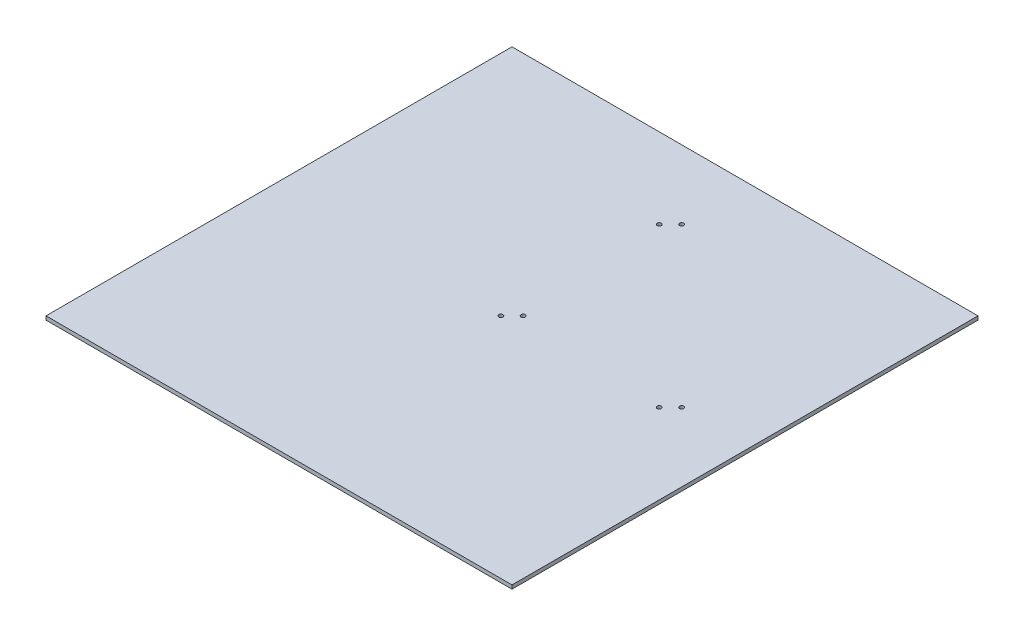
ISO-10303-21;
HEADER;
FILE_DESCRIPTION(('STEP AP214'),'2;1');
FILE_NAME('part.step','',(''),(''),'','','');
FILE_SCHEMA(('AUTOMOTIVE_DESIGN { 1 0 10303 214 1 1 1 1 }'));
ENDSEC;
DATA;
#1=APPLICATION_CONTEXT('core data for automotive mechanical design processes');
#2=APPLICATION_PROTOCOL_DEFINITION('international standard','automotive_design',2000,#1);
#3=PRODUCT_CONTEXT('',#1,'mechanical');
#4=PRODUCT('Part','Part','',(#3));
#5=PRODUCT_RELATED_PRODUCT_CATEGORY('part','',(#4));
#6=PRODUCT_DEFINITION_FORMATION('','',#4);
#7=PRODUCT_DEFINITION_CONTEXT('part definition',#1,'design');
#8=PRODUCT_DEFINITION('design','',#6,#7);
#9=PRODUCT_DEFINITION_SHAPE('','',#8);
#10=(LENGTH_UNIT() NAMED_UNIT(*) SI_UNIT(.MILLI.,.METRE.));
#11=(NAMED_UNIT(*) PLANE_ANGLE_UNIT() SI_UNIT($,.RADIAN.));
#12=(NAMED_UNIT(*) SI_UNIT($,.STERADIAN.) SOLID_ANGLE_UNIT());
#13=UNCERTAINTY_MEASURE_WITH_UNIT(LENGTH_MEASURE(1.E-05),#10,'distance_accuracy_value','');
#14=(GEOMETRIC_REPRESENTATION_CONTEXT(3) GLOBAL_UNCERTAINTY_ASSIGNED_CONTEXT((#13)) GLOBAL_UNIT_ASSIGNED_CONTEXT((#10,
#11,#12)) REPRESENTATION_CONTEXT('',''));
#15=CARTESIAN_POINT('',(0.,0.,0.));
#16=DIRECTION('',(0.,0.,1.));
#17=DIRECTION('',(1.,0.,0.));
#18=AXIS2_PLACEMENT_3D('',#15,#16,#17);
#19=CARTESIAN_POINT('',(0.,4.,0.));
#20=DIRECTION('',(1.,0.,0.));
#21=DIRECTION('',(0.,0.,-1.));
#22=AXIS2_PLACEMENT_3D('',#19,#20,#21);
#23=PLANE('',#22);
#24=DIRECTION('',(0.,0.,1.));
#25=VECTOR('',#24,1.);
#26=CARTESIAN_POINT('',(0.,0.,0.));
#27=LINE('',#26,#25);
#28=CARTESIAN_POINT('',(0.,0.,-500.));
#29=VERTEX_POINT('',#28);
#30=CARTESIAN_POINT('',(0.,0.,0.));
#31=VERTEX_POINT('',#30);
#32=EDGE_CURVE('E96',#29,#31,#27,.T.);
#33=ORIENTED_EDGE('',*,*,#32,.T.);
#34=DIRECTION('',(0.,-1.,0.));
#35=VECTOR('',#34,1.);
#36=CARTESIAN_POINT('',(0.,4.,0.));
#37=LINE('',#36,#35);
#38=CARTESIAN_POINT('',(0.,4.,0.));
#39=VERTEX_POINT('',#38);
#40=EDGE_CURVE('E11',#39,#31,#37,.T.);
#41=ORIENTED_EDGE('',*,*,#40,.F.);
#42=DIRECTION('',(0.,0.,1.));
#43=VECTOR('',#42,1.);
#44=CARTESIAN_POINT('',(0.,4.,0.));
#45=LINE('',#44,#43);
#46=CARTESIAN_POINT('',(0.,4.,-500.));
#47=VERTEX_POINT('',#46);
#48=EDGE_CURVE('E84',#47,#39,#45,.T.);
#49=ORIENTED_EDGE('',*,*,#48,.F.);
#50=DIRECTION('',(0.,-1.,0.));
#51=VECTOR('',#50,1.);
#52=CARTESIAN_POINT('',(0.,4.,-500.));
#53=LINE('',#52,#51);
#54=EDGE_CURVE('E92',#47,#29,#53,.T.);
#55=ORIENTED_EDGE('',*,*,#54,.T.);
#56=EDGE_LOOP('',(#33,#41,#49,#55));
#57=FACE_BOUND('',#56,.T.);
#58=ADVANCED_FACE('F33',(#57),#23,.F.);
#59=CARTESIAN_POINT('',(0.,4.,0.));
#60=DIRECTION('',(0.,0.,-1.));
#61=DIRECTION('',(-1.,0.,0.));
#62=AXIS2_PLACEMENT_3D('',#59,#60,#61);
#63=PLANE('',#62);
#64=DIRECTION('',(1.,0.,0.));
#65=VECTOR('',#64,1.);
#66=CARTESIAN_POINT('',(0.,0.,0.));
#67=LINE('',#66,#65);
#68=CARTESIAN_POINT('',(500.,0.,0.));
#69=VERTEX_POINT('',#68);
#70=EDGE_CURVE('E88',#31,#69,#67,.T.);
#71=ORIENTED_EDGE('',*,*,#70,.T.);
#72=DIRECTION('',(0.,-1.,0.));
#73=VECTOR('',#72,1.);
#74=CARTESIAN_POINT('',(500.,4.,0.));
#75=LINE('',#74,#73);
#76=CARTESIAN_POINT('',(500.,4.,0.));
#77=VERTEX_POINT('',#76);
#78=EDGE_CURVE('E41',#77,#69,#75,.T.);
#79=ORIENTED_EDGE('',*,*,#78,.F.);
#80=DIRECTION('',(1.,0.,0.));
#81=VECTOR('',#80,1.);
#82=CARTESIAN_POINT('',(0.,4.,0.));
#83=LINE('',#82,#81);
#84=EDGE_CURVE('E79',#39,#77,#83,.T.);
#85=ORIENTED_EDGE('',*,*,#84,.F.);
#86=ORIENTED_EDGE('',*,*,#40,.T.);
#87=EDGE_LOOP('',(#71,#79,#85,#86));
#88=FACE_BOUND('',#87,.T.);
#89=ADVANCED_FACE('F87',(#88),#63,.F.);
#90=CARTESIAN_POINT('',(500.,4.,0.));
#91=DIRECTION('',(-1.,0.,0.));
#92=DIRECTION('',(0.,0.,1.));
#93=AXIS2_PLACEMENT_3D('',#90,#91,#92);
#94=PLANE('',#93);
#95=DIRECTION('',(0.,0.,-1.));
#96=VECTOR('',#95,1.);
#97=CARTESIAN_POINT('',(500.,0.,0.));
#98=LINE('',#97,#96);
#99=CARTESIAN_POINT('',(500.,0.,-500.));
#100=VERTEX_POINT('',#99);
#101=EDGE_CURVE('E66',#69,#100,#98,.T.);
#102=ORIENTED_EDGE('',*,*,#101,.T.);
#103=DIRECTION('',(0.,-1.,0.));
#104=VECTOR('',#103,1.);
#105=CARTESIAN_POINT('',(500.,4.,-500.));
#106=LINE('',#105,#104);
#107=CARTESIAN_POINT('',(500.,4.,-500.));
#108=VERTEX_POINT('',#107);
#109=EDGE_CURVE('E89',#108,#100,#106,.T.);
#110=ORIENTED_EDGE('',*,*,#109,.F.);
#111=DIRECTION('',(0.,0.,-1.));
#112=VECTOR('',#111,1.);
#113=CARTESIAN_POINT('',(500.,4.,0.));
#114=LINE('',#113,#112);
#115=EDGE_CURVE('E82',#77,#108,#114,.T.);
#116=ORIENTED_EDGE('',*,*,#115,.F.);
#117=ORIENTED_EDGE('',*,*,#78,.T.);
#118=EDGE_LOOP('',(#102,#110,#116,#117));
#119=FACE_BOUND('',#118,.T.);
#120=ADVANCED_FACE('F90',(#119),#94,.F.);
#121=CARTESIAN_POINT('',(0.,4.,-500.));
#122=DIRECTION('',(0.,0.,1.));
#123=DIRECTION('',(1.,0.,0.));
#124=AXIS2_PLACEMENT_3D('',#121,#122,#123);
#125=PLANE('',#124);
#126=DIRECTION('',(-1.,0.,0.));
#127=VECTOR('',#126,1.);
#128=CARTESIAN_POINT('',(0.,0.,-500.));
#129=LINE('',#128,#127);
#130=EDGE_CURVE('E72',#100,#29,#129,.T.);
#131=ORIENTED_EDGE('',*,*,#130,.T.);
#132=ORIENTED_EDGE('',*,*,#54,.F.);
#133=DIRECTION('',(-1.,0.,0.));
#134=VECTOR('',#133,1.);
#135=CARTESIAN_POINT('',(0.,4.,-500.));
#136=LINE('',#135,#134);
#137=EDGE_CURVE('E49',#108,#47,#136,.T.);
#138=ORIENTED_EDGE('',*,*,#137,.F.);
#139=ORIENTED_EDGE('',*,*,#109,.T.);
#140=EDGE_LOOP('',(#131,#132,#138,#139));
#141=FACE_BOUND('',#140,.T.);
#142=ADVANCED_FACE('F104',(#141),#125,.F.);
#143=CARTESIAN_POINT('',(0.,4.,0.));
#144=DIRECTION('',(0.,-1.,0.));
#145=DIRECTION('',(0.,0.,-1.));
#146=AXIS2_PLACEMENT_3D('',#143,#144,#145);
#147=PLANE('',#146);
#148=CARTESIAN_POINT('',(256.010407640085,4.,-426.010407640086));
#149=DIRECTION('',(0.,1.,0.));
#150=DIRECTION('',(0.,0.,1.));
#151=AXIS2_PLACEMENT_3D('',#148,#149,#150);
#152=CIRCLE('',#151,2.24999999999994);
#153=CARTESIAN_POINT('',(256.010407640085,4.,-423.760407640086));
#154=VERTEX_POINT('',#153);
#155=EDGE_CURVE('E132',#154,#154,#152,.T.);
#156=ORIENTED_EDGE('',*,*,#155,.F.);
#157=EDGE_LOOP('',(#156));
#158=FACE_BOUND('',#157,.T.);
#159=CARTESIAN_POINT('',(413.989592359914,4.,-243.989592359914));
#160=DIRECTION('',(0.,1.,0.));
#161=DIRECTION('',(0.,0.,1.));
#162=AXIS2_PLACEMENT_3D('',#159,#160,#161);
#163=CIRCLE('',#162,2.25000000000001);
#164=CARTESIAN_POINT('',(413.989592359914,4.,-241.739592359914));
#165=VERTEX_POINT('',#164);
#166=EDGE_CURVE('E131',#165,#165,#163,.T.);
#167=ORIENTED_EDGE('',*,*,#166,.F.);
#168=EDGE_LOOP('',(#167));
#169=FACE_BOUND('',#168,.T.);
#170=CARTESIAN_POINT('',(426.010407640086,4.,-256.010407640086));
#171=DIRECTION('',(0.,1.,0.));
#172=DIRECTION('',(0.,0.,1.));
#173=AXIS2_PLACEMENT_3D('',#170,#171,#172);
#174=CIRCLE('',#173,2.2499999999999);
#175=CARTESIAN_POINT('',(426.010407640086,4.,-253.760407640086));
#176=VERTEX_POINT('',#175);
#177=EDGE_CURVE('E120',#176,#176,#174,.T.);
#178=ORIENTED_EDGE('',*,*,#177,.F.);
#179=EDGE_LOOP('',(#178));
#180=FACE_BOUND('',#179,.T.);
#181=CARTESIAN_POINT('',(243.989592359914,4.,-243.989592359914));
#182=DIRECTION('',(0.,1.,0.));
#183=DIRECTION('',(0.,0.,1.));
#184=AXIS2_PLACEMENT_3D('',#181,#182,#183);
#185=CIRCLE('',#184,2.25000000000001);
#186=CARTESIAN_POINT('',(243.989592359914,4.,-241.739592359914));
#187=VERTEX_POINT('',#186);
#188=EDGE_CURVE('E119',#187,#187,#185,.T.);
#189=ORIENTED_EDGE('',*,*,#188,.F.);
#190=EDGE_LOOP('',(#189));
#191=FACE_BOUND('',#190,.T.);
#192=CARTESIAN_POINT('',(243.989592359914,4.,-413.989592359914));
#193=DIRECTION('',(0.,1.,0.));
#194=DIRECTION('',(0.,0.,1.));
#195=AXIS2_PLACEMENT_3D('',#192,#193,#194);
#196=CIRCLE('',#195,2.25000000000003);
#197=CARTESIAN_POINT('',(243.989592359914,4.,-411.739592359914));
#198=VERTEX_POINT('',#197);
#199=EDGE_CURVE('E142',#198,#198,#196,.T.);
#200=ORIENTED_EDGE('',*,*,#199,.F.);
#201=EDGE_LOOP('',(#200));
#202=FACE_BOUND('',#201,.T.);
#203=CARTESIAN_POINT('',(256.010407640086,4.,-256.010407640086));
#204=DIRECTION('',(0.,1.,0.));
#205=DIRECTION('',(0.,0.,1.));
#206=AXIS2_PLACEMENT_3D('',#203,#204,#205);
#207=CIRCLE('',#206,2.24999999999996);
#208=CARTESIAN_POINT('',(256.010407640086,4.,-253.760407640086));
#209=VERTEX_POINT('',#208);
#210=EDGE_CURVE('E112',#209,#209,#207,.T.);
#211=ORIENTED_EDGE('',*,*,#210,.F.);
#212=EDGE_LOOP('',(#211));
#213=FACE_BOUND('',#212,.T.);
#214=ORIENTED_EDGE('',*,*,#48,.T.);
#215=ORIENTED_EDGE('',*,*,#84,.T.);
#216=ORIENTED_EDGE('',*,*,#115,.T.);
#217=ORIENTED_EDGE('',*,*,#137,.T.);
#218=EDGE_LOOP('',(#214,#215,#216,#217));
#219=FACE_BOUND('',#218,.T.);
#220=ADVANCED_FACE('F80',(#158,#169,#180,#191,#202,#213,#219),#147,.F.);
#221=CARTESIAN_POINT('',(0.,0.,0.));
#222=DIRECTION('',(0.,-1.,0.));
#223=DIRECTION('',(0.,0.,-1.));
#224=AXIS2_PLACEMENT_3D('',#221,#222,#223);
#225=PLANE('',#224);
#226=CARTESIAN_POINT('',(256.010407640085,0.,-426.010407640086));
#227=DIRECTION('',(0.,-1.,0.));
#228=DIRECTION('',(0.,0.,-1.));
#229=AXIS2_PLACEMENT_3D('',#226,#227,#228);
#230=CIRCLE('',#229,2.24999999999994);
#231=CARTESIAN_POINT('',(256.010407640085,0.,-428.260407640086));
#232=VERTEX_POINT('',#231);
#233=EDGE_CURVE('E128',#232,#232,#230,.F.);
#234=ORIENTED_EDGE('',*,*,#233,.T.);
#235=EDGE_LOOP('',(#234));
#236=FACE_BOUND('',#235,.T.);
#237=CARTESIAN_POINT('',(413.989592359914,0.,-243.989592359914));
#238=DIRECTION('',(0.,-1.,0.));
#239=DIRECTION('',(0.,0.,-1.));
#240=AXIS2_PLACEMENT_3D('',#237,#238,#239);
#241=CIRCLE('',#240,2.25000000000001);
#242=CARTESIAN_POINT('',(413.989592359914,0.,-246.239592359914));
#243=VERTEX_POINT('',#242);
#244=EDGE_CURVE('E123',#243,#243,#241,.F.);
#245=ORIENTED_EDGE('',*,*,#244,.T.);
#246=EDGE_LOOP('',(#245));
#247=FACE_BOUND('',#246,.T.);
#248=CARTESIAN_POINT('',(426.010407640086,0.,-256.010407640086));
#249=DIRECTION('',(0.,-1.,0.));
#250=DIRECTION('',(0.,0.,-1.));
#251=AXIS2_PLACEMENT_3D('',#248,#249,#250);
#252=CIRCLE('',#251,2.2499999999999);
#253=CARTESIAN_POINT('',(426.010407640086,0.,-258.260407640086));
#254=VERTEX_POINT('',#253);
#255=EDGE_CURVE('E116',#254,#254,#252,.F.);
#256=ORIENTED_EDGE('',*,*,#255,.T.);
#257=EDGE_LOOP('',(#256));
#258=FACE_BOUND('',#257,.T.);
#259=CARTESIAN_POINT('',(243.989592359914,0.,-243.989592359914));
#260=DIRECTION('',(0.,-1.,0.));
#261=DIRECTION('',(0.,0.,-1.));
#262=AXIS2_PLACEMENT_3D('',#259,#260,#261);
#263=CIRCLE('',#262,2.25000000000001);
#264=CARTESIAN_POINT('',(243.989592359914,0.,-246.239592359914));
#265=VERTEX_POINT('',#264);
#266=EDGE_CURVE('E115',#265,#265,#263,.F.);
#267=ORIENTED_EDGE('',*,*,#266,.T.);
#268=EDGE_LOOP('',(#267));
#269=FACE_BOUND('',#268,.T.);
#270=CARTESIAN_POINT('',(243.989592359914,0.,-413.989592359914));
#271=DIRECTION('',(0.,-1.,0.));
#272=DIRECTION('',(0.,0.,-1.));
#273=AXIS2_PLACEMENT_3D('',#270,#271,#272);
#274=CIRCLE('',#273,2.25000000000003);
#275=CARTESIAN_POINT('',(243.989592359914,0.,-416.239592359914));
#276=VERTEX_POINT('',#275);
#277=EDGE_CURVE('E135',#276,#276,#274,.F.);
#278=ORIENTED_EDGE('',*,*,#277,.T.);
#279=EDGE_LOOP('',(#278));
#280=FACE_BOUND('',#279,.T.);
#281=CARTESIAN_POINT('',(256.010407640086,0.,-256.010407640086));
#282=DIRECTION('',(0.,-1.,0.));
#283=DIRECTION('',(0.,0.,-1.));
#284=AXIS2_PLACEMENT_3D('',#281,#282,#283);
#285=CIRCLE('',#284,2.24999999999996);
#286=CARTESIAN_POINT('',(256.010407640086,0.,-258.260407640086));
#287=VERTEX_POINT('',#286);
#288=EDGE_CURVE('E99',#287,#287,#285,.F.);
#289=ORIENTED_EDGE('',*,*,#288,.T.);
#290=EDGE_LOOP('',(#289));
#291=FACE_BOUND('',#290,.T.);
#292=ORIENTED_EDGE('',*,*,#32,.F.);
#293=ORIENTED_EDGE('',*,*,#130,.F.);
#294=ORIENTED_EDGE('',*,*,#101,.F.);
#295=ORIENTED_EDGE('',*,*,#70,.F.);
#296=EDGE_LOOP('',(#292,#293,#294,#295));
#297=FACE_BOUND('',#296,.T.);
#298=ADVANCED_FACE('F107',(#236,#247,#258,#269,#280,#291,#297),#225,.T.);
#299=CARTESIAN_POINT('',(256.010407640086,-6.36396103067901,-256.010407640086));
#300=DIRECTION('',(0.,1.,0.));
#301=DIRECTION('',(0.,0.,1.));
#302=AXIS2_PLACEMENT_3D('',#299,#300,#301);
#303=CYLINDRICAL_SURFACE('',#302,2.24999999999996);
#304=ORIENTED_EDGE('',*,*,#210,.T.);
#305=EDGE_LOOP('',(#304));
#306=FACE_BOUND('',#305,.T.);
#307=ORIENTED_EDGE('',*,*,#288,.F.);
#308=EDGE_LOOP('',(#307));
#309=FACE_BOUND('',#308,.T.);
#310=ADVANCED_FACE('F155',(#306,#309),#303,.F.);
#311=CARTESIAN_POINT('',(243.989592359914,-6.36396103067901,-413.989592359914));
#312=DIRECTION('',(0.,1.,0.));
#313=DIRECTION('',(0.,0.,1.));
#314=AXIS2_PLACEMENT_3D('',#311,#312,#313);
#315=CYLINDRICAL_SURFACE('',#314,2.25000000000003);
#316=ORIENTED_EDGE('',*,*,#199,.T.);
#317=EDGE_LOOP('',(#316));
#318=FACE_BOUND('',#317,.T.);
#319=ORIENTED_EDGE('',*,*,#277,.F.);
#320=EDGE_LOOP('',(#319));
#321=FACE_BOUND('',#320,.T.);
#322=ADVANCED_FACE('F146',(#318,#321),#315,.F.);
#323=CARTESIAN_POINT('',(243.989592359914,-6.36396103067901,-243.989592359914));
#324=DIRECTION('',(0.,1.,0.));
#325=DIRECTION('',(0.,0.,1.));
#326=AXIS2_PLACEMENT_3D('',#323,#324,#325);
#327=CYLINDRICAL_SURFACE('',#326,2.25000000000001);
#328=ORIENTED_EDGE('',*,*,#188,.T.);
#329=EDGE_LOOP('',(#328));
#330=FACE_BOUND('',#329,.T.);
#331=ORIENTED_EDGE('',*,*,#266,.F.);
#332=EDGE_LOOP('',(#331));
#333=FACE_BOUND('',#332,.T.);
#334=ADVANCED_FACE('F204',(#330,#333),#327,.F.);
#335=CARTESIAN_POINT('',(426.010407640086,-6.36396103067901,-256.010407640086));
#336=DIRECTION('',(0.,1.,0.));
#337=DIRECTION('',(0.,0.,1.));
#338=AXIS2_PLACEMENT_3D('',#335,#336,#337);
#339=CYLINDRICAL_SURFACE('',#338,2.2499999999999);
#340=ORIENTED_EDGE('',*,*,#177,.T.);
#341=EDGE_LOOP('',(#340));
#342=FACE_BOUND('',#341,.T.);
#343=ORIENTED_EDGE('',*,*,#255,.F.);
#344=EDGE_LOOP('',(#343));
#345=FACE_BOUND('',#344,.T.);
#346=ADVANCED_FACE('F213',(#342,#345),#339,.F.);
#347=CARTESIAN_POINT('',(413.989592359914,-6.36396103067901,-243.989592359914));
#348=DIRECTION('',(0.,1.,0.));
#349=DIRECTION('',(0.,0.,1.));
#350=AXIS2_PLACEMENT_3D('',#347,#348,#349);
#351=CYLINDRICAL_SURFACE('',#350,2.25000000000001);
#352=ORIENTED_EDGE('',*,*,#166,.T.);
#353=EDGE_LOOP('',(#352));
#354=FACE_BOUND('',#353,.T.);
#355=ORIENTED_EDGE('',*,*,#244,.F.);
#356=EDGE_LOOP('',(#355));
#357=FACE_BOUND('',#356,.T.);
#358=ADVANCED_FACE('F223',(#354,#357),#351,.F.);
#359=CARTESIAN_POINT('',(256.010407640085,-6.36396103067901,-426.010407640086));
#360=DIRECTION('',(0.,1.,0.));
#361=DIRECTION('',(0.,0.,1.));
#362=AXIS2_PLACEMENT_3D('',#359,#360,#361);
#363=CYLINDRICAL_SURFACE('',#362,2.24999999999994);
#364=ORIENTED_EDGE('',*,*,#155,.T.);
#365=EDGE_LOOP('',(#364));
#366=FACE_BOUND('',#365,.T.);
#367=ORIENTED_EDGE('',*,*,#233,.F.);
#368=EDGE_LOOP('',(#367));
#369=FACE_BOUND('',#368,.T.);
#370=ADVANCED_FACE('F233',(#366,#369),#363,.F.);
#371=CLOSED_SHELL('',(#58,#89,#120,#142,#220,#298,#310,#322,#334,#346,#358,#370));
#372=MANIFOLD_SOLID_BREP('B2',#371);
#373=ADVANCED_BREP_SHAPE_REPRESENTATION('',(#18,#372),#14);
#374=SHAPE_DEFINITION_REPRESENTATION(#9,#373);
ENDSEC;
END-ISO-10303-21;
